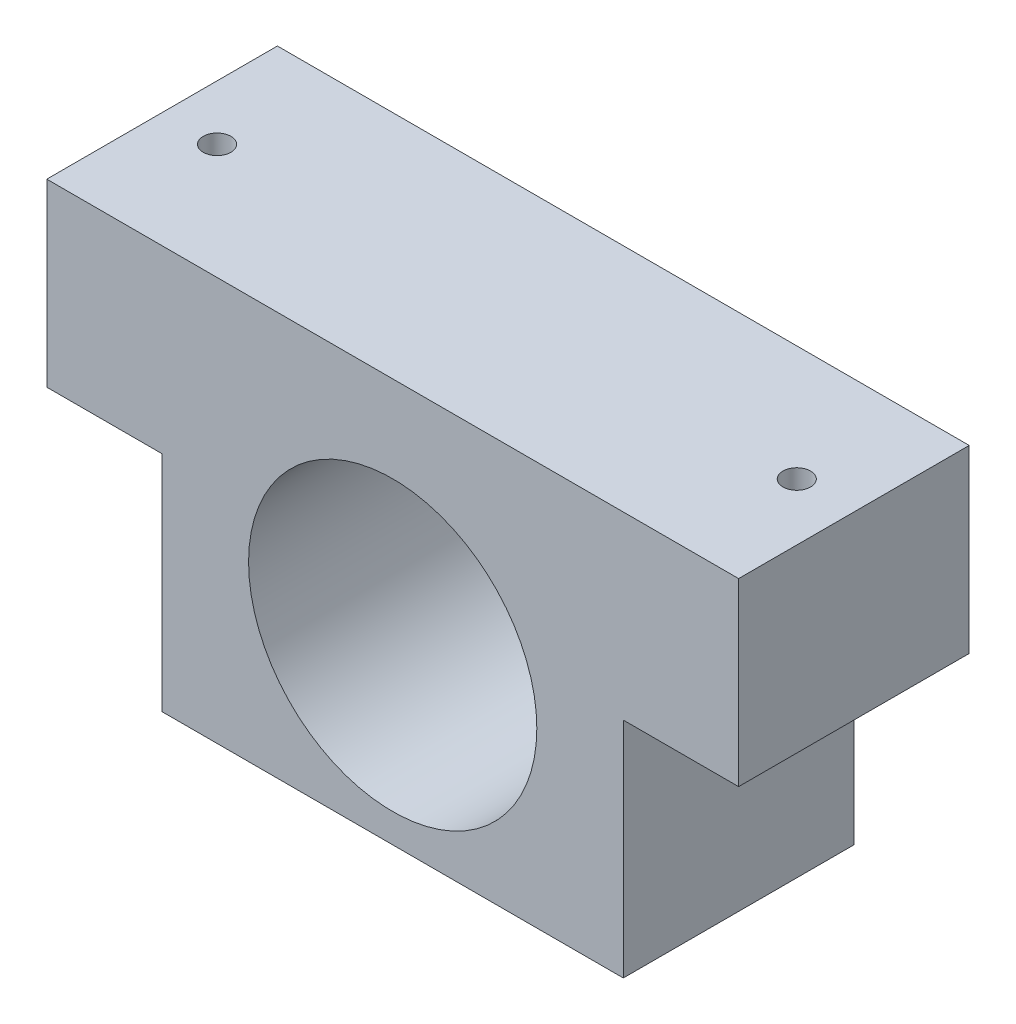
ISO-10303-21;
HEADER;
FILE_DESCRIPTION(('STEP AP214'),'2;1');
FILE_NAME('part.step','',(''),(''),'','','');
FILE_SCHEMA(('AUTOMOTIVE_DESIGN { 1 0 10303 214 1 1 1 1 }'));
ENDSEC;
DATA;
#1=APPLICATION_CONTEXT('core data for automotive mechanical design processes');
#2=APPLICATION_PROTOCOL_DEFINITION('international standard','automotive_design',2000,#1);
#3=PRODUCT_CONTEXT('',#1,'mechanical');
#4=PRODUCT('Part','Part','',(#3));
#5=PRODUCT_RELATED_PRODUCT_CATEGORY('part','',(#4));
#6=PRODUCT_DEFINITION_FORMATION('','',#4);
#7=PRODUCT_DEFINITION_CONTEXT('part definition',#1,'design');
#8=PRODUCT_DEFINITION('design','',#6,#7);
#9=PRODUCT_DEFINITION_SHAPE('','',#8);
#10=(LENGTH_UNIT() NAMED_UNIT(*) SI_UNIT(.MILLI.,.METRE.));
#11=(NAMED_UNIT(*) PLANE_ANGLE_UNIT() SI_UNIT($,.RADIAN.));
#12=(NAMED_UNIT(*) SI_UNIT($,.STERADIAN.) SOLID_ANGLE_UNIT());
#13=UNCERTAINTY_MEASURE_WITH_UNIT(LENGTH_MEASURE(1.E-05),#10,'distance_accuracy_value','');
#14=(GEOMETRIC_REPRESENTATION_CONTEXT(3) GLOBAL_UNCERTAINTY_ASSIGNED_CONTEXT((#13)) GLOBAL_UNIT_ASSIGNED_CONTEXT((#10,
#11,#12)) REPRESENTATION_CONTEXT('',''));
#15=CARTESIAN_POINT('',(0.,0.,0.));
#16=DIRECTION('',(0.,0.,1.));
#17=DIRECTION('',(1.,0.,0.));
#18=AXIS2_PLACEMENT_3D('',#15,#16,#17);
#19=CARTESIAN_POINT('',(0.,-145.626712597805,20.));
#20=DIRECTION('',(0.,1.,0.));
#21=DIRECTION('',(0.,0.,1.));
#22=AXIS2_PLACEMENT_3D('',#19,#20,#21);
#23=PLANE('',#22);
#24=CARTESIAN_POINT('',(-335.89732101394,-145.626712597805,10.));
#25=DIRECTION('',(0.,-1.,0.));
#26=DIRECTION('',(0.,0.,-1.));
#27=AXIS2_PLACEMENT_3D('',#24,#25,#26);
#28=CIRCLE('',#27,3.);
#29=CARTESIAN_POINT('',(-335.89732101394,-145.626712597805,7.));
#30=VERTEX_POINT('',#29);
#31=EDGE_CURVE('E210',#30,#30,#28,.T.);
#32=ORIENTED_EDGE('',*,*,#31,.F.);
#33=EDGE_LOOP('',(#32));
#34=FACE_BOUND('',#33,.T.);
#35=DIRECTION('',(1.,0.,0.));
#36=VECTOR('',#35,1.);
#37=CARTESIAN_POINT('',(0.,-145.626712597805,0.));
#38=LINE('',#37,#36);
#39=CARTESIAN_POINT('',(-340.665411140263,-145.626712597805,0.));
#40=VERTEX_POINT('',#39);
#41=CARTESIAN_POINT('',(-330.665411140263,-145.626712597805,0.));
#42=VERTEX_POINT('',#41);
#43=EDGE_CURVE('E138',#40,#42,#38,.T.);
#44=ORIENTED_EDGE('',*,*,#43,.T.);
#45=DIRECTION('',(0.,0.,-1.));
#46=VECTOR('',#45,1.);
#47=CARTESIAN_POINT('',(-330.665411140263,-145.626712597805,20.));
#48=LINE('',#47,#46);
#49=CARTESIAN_POINT('',(-330.665411140263,-145.626712597805,20.));
#50=VERTEX_POINT('',#49);
#51=EDGE_CURVE('E11',#50,#42,#48,.T.);
#52=ORIENTED_EDGE('',*,*,#51,.F.);
#53=DIRECTION('',(1.,0.,0.));
#54=VECTOR('',#53,1.);
#55=CARTESIAN_POINT('',(0.,-145.626712597805,20.));
#56=LINE('',#55,#54);
#57=CARTESIAN_POINT('',(-340.665411140263,-145.626712597805,20.));
#58=VERTEX_POINT('',#57);
#59=EDGE_CURVE('E184',#58,#50,#56,.T.);
#60=ORIENTED_EDGE('',*,*,#59,.F.);
#61=DIRECTION('',(0.,0.,-1.));
#62=VECTOR('',#61,1.);
#63=CARTESIAN_POINT('',(-340.665411140263,-145.626712597805,20.));
#64=LINE('',#63,#62);
#65=EDGE_CURVE('E131',#58,#40,#64,.T.);
#66=ORIENTED_EDGE('',*,*,#65,.T.);
#67=EDGE_LOOP('',(#44,#52,#60,#66));
#68=FACE_BOUND('',#67,.T.);
#69=ADVANCED_FACE('F39',(#34,#68),#23,.F.);
#70=CARTESIAN_POINT('',(-330.665411140263,0.,20.));
#71=DIRECTION('',(1.,0.,0.));
#72=DIRECTION('',(0.,0.,-1.));
#73=AXIS2_PLACEMENT_3D('',#70,#71,#72);
#74=PLANE('',#73);
#75=DIRECTION('',(0.,-1.,0.));
#76=VECTOR('',#75,1.);
#77=CARTESIAN_POINT('',(-330.665411140263,0.,0.));
#78=LINE('',#77,#76);
#79=CARTESIAN_POINT('',(-330.665411140263,-165.,0.));
#80=VERTEX_POINT('',#79);
#81=EDGE_CURVE('E142',#42,#80,#78,.T.);
#82=ORIENTED_EDGE('',*,*,#81,.T.);
#83=DIRECTION('',(0.,0.,-1.));
#84=VECTOR('',#83,1.);
#85=CARTESIAN_POINT('',(-330.665411140263,-165.,20.));
#86=LINE('',#85,#84);
#87=CARTESIAN_POINT('',(-330.665411140263,-165.,20.));
#88=VERTEX_POINT('',#87);
#89=EDGE_CURVE('E48',#88,#80,#86,.T.);
#90=ORIENTED_EDGE('',*,*,#89,.F.);
#91=DIRECTION('',(0.,-1.,0.));
#92=VECTOR('',#91,1.);
#93=CARTESIAN_POINT('',(-330.665411140263,0.,20.));
#94=LINE('',#93,#92);
#95=EDGE_CURVE('E95',#50,#88,#94,.T.);
#96=ORIENTED_EDGE('',*,*,#95,.F.);
#97=ORIENTED_EDGE('',*,*,#51,.T.);
#98=EDGE_LOOP('',(#82,#90,#96,#97));
#99=FACE_BOUND('',#98,.T.);
#100=ADVANCED_FACE('F171',(#99),#74,.F.);
#101=CARTESIAN_POINT('',(0.,-165.,20.));
#102=DIRECTION('',(0.,-1.,0.));
#103=DIRECTION('',(0.,0.,-1.));
#104=AXIS2_PLACEMENT_3D('',#101,#102,#103);
#105=PLANE('',#104);
#106=DIRECTION('',(-1.,0.,0.));
#107=VECTOR('',#106,1.);
#108=CARTESIAN_POINT('',(0.,-165.,0.));
#109=LINE('',#108,#107);
#110=CARTESIAN_POINT('',(-290.665411140263,-165.,0.));
#111=VERTEX_POINT('',#110);
#112=EDGE_CURVE('E145',#111,#80,#109,.T.);
#113=ORIENTED_EDGE('',*,*,#112,.F.);
#114=DIRECTION('',(0.,0.,-1.));
#115=VECTOR('',#114,1.);
#116=CARTESIAN_POINT('',(-290.665411140263,-165.,20.));
#117=LINE('',#116,#115);
#118=CARTESIAN_POINT('',(-290.665411140263,-165.,20.));
#119=VERTEX_POINT('',#118);
#120=EDGE_CURVE('E164',#119,#111,#117,.T.);
#121=ORIENTED_EDGE('',*,*,#120,.F.);
#122=DIRECTION('',(-1.,0.,0.));
#123=VECTOR('',#122,1.);
#124=CARTESIAN_POINT('',(0.,-165.,20.));
#125=LINE('',#124,#123);
#126=EDGE_CURVE('E170',#119,#88,#125,.T.);
#127=ORIENTED_EDGE('',*,*,#126,.T.);
#128=ORIENTED_EDGE('',*,*,#89,.T.);
#129=EDGE_LOOP('',(#113,#121,#127,#128));
#130=FACE_BOUND('',#129,.T.);
#131=ADVANCED_FACE('F168',(#130),#105,.T.);
#132=CARTESIAN_POINT('',(-290.665411140263,0.,20.));
#133=DIRECTION('',(1.,0.,0.));
#134=DIRECTION('',(0.,0.,-1.));
#135=AXIS2_PLACEMENT_3D('',#132,#133,#134);
#136=PLANE('',#135);
#137=DIRECTION('',(0.,-1.,0.));
#138=VECTOR('',#137,1.);
#139=CARTESIAN_POINT('',(-290.665411140263,0.,0.));
#140=LINE('',#139,#138);
#141=CARTESIAN_POINT('',(-290.665411140263,-145.626712597805,0.));
#142=VERTEX_POINT('',#141);
#143=EDGE_CURVE('E148',#142,#111,#140,.T.);
#144=ORIENTED_EDGE('',*,*,#143,.F.);
#145=DIRECTION('',(0.,0.,-1.));
#146=VECTOR('',#145,1.);
#147=CARTESIAN_POINT('',(-290.665411140263,-145.626712597805,20.));
#148=LINE('',#147,#146);
#149=CARTESIAN_POINT('',(-290.665411140263,-145.626712597805,20.));
#150=VERTEX_POINT('',#149);
#151=EDGE_CURVE('E162',#150,#142,#148,.T.);
#152=ORIENTED_EDGE('',*,*,#151,.F.);
#153=DIRECTION('',(0.,-1.,0.));
#154=VECTOR('',#153,1.);
#155=CARTESIAN_POINT('',(-290.665411140263,0.,20.));
#156=LINE('',#155,#154);
#157=EDGE_CURVE('E181',#150,#119,#156,.T.);
#158=ORIENTED_EDGE('',*,*,#157,.T.);
#159=ORIENTED_EDGE('',*,*,#120,.T.);
#160=EDGE_LOOP('',(#144,#152,#158,#159));
#161=FACE_BOUND('',#160,.T.);
#162=ADVANCED_FACE('F179',(#161),#136,.T.);
#163=CARTESIAN_POINT('',(0.,-145.626712597805,20.));
#164=DIRECTION('',(0.,1.,0.));
#165=DIRECTION('',(0.,0.,1.));
#166=AXIS2_PLACEMENT_3D('',#163,#164,#165);
#167=PLANE('',#166);
#168=CARTESIAN_POINT('',(-285.620390856453,-145.626712597805,10.));
#169=DIRECTION('',(0.,-1.,0.));
#170=DIRECTION('',(0.,0.,-1.));
#171=AXIS2_PLACEMENT_3D('',#168,#169,#170);
#172=CIRCLE('',#171,3.);
#173=CARTESIAN_POINT('',(-285.620390856453,-145.626712597805,7.));
#174=VERTEX_POINT('',#173);
#175=EDGE_CURVE('E198',#174,#174,#172,.T.);
#176=ORIENTED_EDGE('',*,*,#175,.F.);
#177=EDGE_LOOP('',(#176));
#178=FACE_BOUND('',#177,.T.);
#179=DIRECTION('',(1.,0.,0.));
#180=VECTOR('',#179,1.);
#181=CARTESIAN_POINT('',(0.,-145.626712597805,0.));
#182=LINE('',#181,#180);
#183=CARTESIAN_POINT('',(-280.665411140263,-145.626712597805,0.));
#184=VERTEX_POINT('',#183);
#185=EDGE_CURVE('E151',#142,#184,#182,.T.);
#186=ORIENTED_EDGE('',*,*,#185,.T.);
#187=DIRECTION('',(0.,0.,-1.));
#188=VECTOR('',#187,1.);
#189=CARTESIAN_POINT('',(-280.665411140263,-145.626712597805,20.));
#190=LINE('',#189,#188);
#191=CARTESIAN_POINT('',(-280.665411140263,-145.626712597805,20.));
#192=VERTEX_POINT('',#191);
#193=EDGE_CURVE('E120',#192,#184,#190,.T.);
#194=ORIENTED_EDGE('',*,*,#193,.F.);
#195=DIRECTION('',(1.,0.,0.));
#196=VECTOR('',#195,1.);
#197=CARTESIAN_POINT('',(0.,-145.626712597805,20.));
#198=LINE('',#197,#196);
#199=EDGE_CURVE('E126',#150,#192,#198,.T.);
#200=ORIENTED_EDGE('',*,*,#199,.F.);
#201=ORIENTED_EDGE('',*,*,#151,.T.);
#202=EDGE_LOOP('',(#186,#194,#200,#201));
#203=FACE_BOUND('',#202,.T.);
#204=ADVANCED_FACE('F236',(#178,#203),#167,.F.);
#205=CARTESIAN_POINT('',(-280.665411140263,0.,20.));
#206=DIRECTION('',(1.,0.,0.));
#207=DIRECTION('',(0.,0.,-1.));
#208=AXIS2_PLACEMENT_3D('',#205,#206,#207);
#209=PLANE('',#208);
#210=DIRECTION('',(0.,-1.,0.));
#211=VECTOR('',#210,1.);
#212=CARTESIAN_POINT('',(-280.665411140263,0.,0.));
#213=LINE('',#212,#211);
#214=CARTESIAN_POINT('',(-280.665411140263,-130.,0.));
#215=VERTEX_POINT('',#214);
#216=EDGE_CURVE('E115',#215,#184,#213,.T.);
#217=ORIENTED_EDGE('',*,*,#216,.F.);
#218=DIRECTION('',(0.,0.,-1.));
#219=VECTOR('',#218,1.);
#220=CARTESIAN_POINT('',(-280.665411140263,-130.,20.));
#221=LINE('',#220,#219);
#222=CARTESIAN_POINT('',(-280.665411140263,-130.,20.));
#223=VERTEX_POINT('',#222);
#224=EDGE_CURVE('E110',#223,#215,#221,.T.);
#225=ORIENTED_EDGE('',*,*,#224,.F.);
#226=DIRECTION('',(0.,-1.,0.));
#227=VECTOR('',#226,1.);
#228=CARTESIAN_POINT('',(-280.665411140263,0.,20.));
#229=LINE('',#228,#227);
#230=EDGE_CURVE('E113',#223,#192,#229,.T.);
#231=ORIENTED_EDGE('',*,*,#230,.T.);
#232=ORIENTED_EDGE('',*,*,#193,.T.);
#233=EDGE_LOOP('',(#217,#225,#231,#232));
#234=FACE_BOUND('',#233,.T.);
#235=ADVANCED_FACE('F112',(#234),#209,.T.);
#236=CARTESIAN_POINT('',(0.,-130.,20.));
#237=DIRECTION('',(0.,1.,0.));
#238=DIRECTION('',(0.,0.,1.));
#239=AXIS2_PLACEMENT_3D('',#236,#237,#238);
#240=PLANE('',#239);
#241=CARTESIAN_POINT('',(-335.89732101394,-130.,10.));
#242=DIRECTION('',(0.,-1.,0.));
#243=DIRECTION('',(0.,0.,-1.));
#244=AXIS2_PLACEMENT_3D('',#241,#242,#243);
#245=CIRCLE('',#244,1.19999999999998);
#246=CARTESIAN_POINT('',(-335.89732101394,-130.,8.80000000000002));
#247=VERTEX_POINT('',#246);
#248=EDGE_CURVE('E201',#247,#247,#245,.T.);
#249=ORIENTED_EDGE('',*,*,#248,.T.);
#250=EDGE_LOOP('',(#249));
#251=FACE_BOUND('',#250,.T.);
#252=CARTESIAN_POINT('',(-285.620390856453,-130.,10.));
#253=DIRECTION('',(0.,-1.,0.));
#254=DIRECTION('',(0.,0.,-1.));
#255=AXIS2_PLACEMENT_3D('',#252,#253,#254);
#256=CIRCLE('',#255,1.19999999999998);
#257=CARTESIAN_POINT('',(-285.620390856453,-130.,8.80000000000002));
#258=VERTEX_POINT('',#257);
#259=EDGE_CURVE('E139',#258,#258,#256,.T.);
#260=ORIENTED_EDGE('',*,*,#259,.T.);
#261=EDGE_LOOP('',(#260));
#262=FACE_BOUND('',#261,.T.);
#263=DIRECTION('',(1.,0.,0.));
#264=VECTOR('',#263,1.);
#265=CARTESIAN_POINT('',(0.,-130.,0.));
#266=LINE('',#265,#264);
#267=CARTESIAN_POINT('',(-340.665411140263,-130.,0.));
#268=VERTEX_POINT('',#267);
#269=EDGE_CURVE('E155',#268,#215,#266,.T.);
#270=ORIENTED_EDGE('',*,*,#269,.F.);
#271=DIRECTION('',(0.,0.,-1.));
#272=VECTOR('',#271,1.);
#273=CARTESIAN_POINT('',(-340.665411140263,-130.,20.));
#274=LINE('',#273,#272);
#275=CARTESIAN_POINT('',(-340.665411140263,-130.,20.));
#276=VERTEX_POINT('',#275);
#277=EDGE_CURVE('E84',#276,#268,#274,.T.);
#278=ORIENTED_EDGE('',*,*,#277,.F.);
#279=DIRECTION('',(1.,0.,0.));
#280=VECTOR('',#279,1.);
#281=CARTESIAN_POINT('',(0.,-130.,20.));
#282=LINE('',#281,#280);
#283=EDGE_CURVE('E123',#276,#223,#282,.T.);
#284=ORIENTED_EDGE('',*,*,#283,.T.);
#285=ORIENTED_EDGE('',*,*,#224,.T.);
#286=EDGE_LOOP('',(#270,#278,#284,#285));
#287=FACE_BOUND('',#286,.T.);
#288=ADVANCED_FACE('F129',(#251,#262,#287),#240,.T.);
#289=CARTESIAN_POINT('',(-310.665411140263,-150.,20.));
#290=DIRECTION('',(0.,0.,-1.));
#291=DIRECTION('',(-1.,0.,0.));
#292=AXIS2_PLACEMENT_3D('',#289,#290,#291);
#293=CYLINDRICAL_SURFACE('',#292,12.5);
#294=CARTESIAN_POINT('',(-310.665411140263,-150.,20.));
#295=DIRECTION('',(0.,0.,1.));
#296=DIRECTION('',(1.,0.,0.));
#297=AXIS2_PLACEMENT_3D('',#294,#295,#296);
#298=CIRCLE('',#297,12.5);
#299=CARTESIAN_POINT('',(-298.165411140263,-150.,20.));
#300=VERTEX_POINT('',#299);
#301=EDGE_CURVE('E158',#300,#300,#298,.T.);
#302=ORIENTED_EDGE('',*,*,#301,.T.);
#303=EDGE_LOOP('',(#302));
#304=FACE_BOUND('',#303,.T.);
#305=CARTESIAN_POINT('',(-310.665411140263,-150.,0.));
#306=DIRECTION('',(0.,0.,1.));
#307=DIRECTION('',(1.,0.,0.));
#308=AXIS2_PLACEMENT_3D('',#305,#306,#307);
#309=CIRCLE('',#308,12.5);
#310=CARTESIAN_POINT('',(-298.165411140263,-150.,0.));
#311=VERTEX_POINT('',#310);
#312=EDGE_CURVE('E135',#311,#311,#309,.T.);
#313=ORIENTED_EDGE('',*,*,#312,.F.);
#314=EDGE_LOOP('',(#313));
#315=FACE_BOUND('',#314,.T.);
#316=ADVANCED_FACE('F41',(#304,#315),#293,.F.);
#317=CARTESIAN_POINT('',(-340.665411140263,0.,20.));
#318=DIRECTION('',(1.,0.,0.));
#319=DIRECTION('',(0.,0.,-1.));
#320=AXIS2_PLACEMENT_3D('',#317,#318,#319);
#321=PLANE('',#320);
#322=DIRECTION('',(0.,-1.,0.));
#323=VECTOR('',#322,1.);
#324=CARTESIAN_POINT('',(-340.665411140263,0.,0.));
#325=LINE('',#324,#323);
#326=EDGE_CURVE('E87',#268,#40,#325,.T.);
#327=ORIENTED_EDGE('',*,*,#326,.T.);
#328=ORIENTED_EDGE('',*,*,#65,.F.);
#329=DIRECTION('',(0.,-1.,0.));
#330=VECTOR('',#329,1.);
#331=CARTESIAN_POINT('',(-340.665411140263,0.,20.));
#332=LINE('',#331,#330);
#333=EDGE_CURVE('E56',#276,#58,#332,.T.);
#334=ORIENTED_EDGE('',*,*,#333,.F.);
#335=ORIENTED_EDGE('',*,*,#277,.T.);
#336=EDGE_LOOP('',(#327,#328,#334,#335));
#337=FACE_BOUND('',#336,.T.);
#338=ADVANCED_FACE('F219',(#337),#321,.F.);
#339=CARTESIAN_POINT('',(0.,0.,20.));
#340=DIRECTION('',(0.,0.,1.));
#341=DIRECTION('',(1.,0.,0.));
#342=AXIS2_PLACEMENT_3D('',#339,#340,#341);
#343=PLANE('',#342);
#344=ORIENTED_EDGE('',*,*,#301,.F.);
#345=EDGE_LOOP('',(#344));
#346=FACE_BOUND('',#345,.T.);
#347=ORIENTED_EDGE('',*,*,#59,.T.);
#348=ORIENTED_EDGE('',*,*,#95,.T.);
#349=ORIENTED_EDGE('',*,*,#126,.F.);
#350=ORIENTED_EDGE('',*,*,#157,.F.);
#351=ORIENTED_EDGE('',*,*,#199,.T.);
#352=ORIENTED_EDGE('',*,*,#230,.F.);
#353=ORIENTED_EDGE('',*,*,#283,.F.);
#354=ORIENTED_EDGE('',*,*,#333,.T.);
#355=EDGE_LOOP('',(#347,#348,#349,#350,#351,#352,#353,#354));
#356=FACE_BOUND('',#355,.T.);
#357=ADVANCED_FACE('F122',(#346,#356),#343,.T.);
#358=CARTESIAN_POINT('',(0.,0.,0.));
#359=DIRECTION('',(0.,0.,1.));
#360=DIRECTION('',(1.,0.,0.));
#361=AXIS2_PLACEMENT_3D('',#358,#359,#360);
#362=PLANE('',#361);
#363=ORIENTED_EDGE('',*,*,#312,.T.);
#364=EDGE_LOOP('',(#363));
#365=FACE_BOUND('',#364,.T.);
#366=ORIENTED_EDGE('',*,*,#43,.F.);
#367=ORIENTED_EDGE('',*,*,#326,.F.);
#368=ORIENTED_EDGE('',*,*,#269,.T.);
#369=ORIENTED_EDGE('',*,*,#216,.T.);
#370=ORIENTED_EDGE('',*,*,#185,.F.);
#371=ORIENTED_EDGE('',*,*,#143,.T.);
#372=ORIENTED_EDGE('',*,*,#112,.T.);
#373=ORIENTED_EDGE('',*,*,#81,.F.);
#374=EDGE_LOOP('',(#366,#367,#368,#369,#370,#371,#372,#373));
#375=FACE_BOUND('',#374,.T.);
#376=ADVANCED_FACE('F175',(#365,#375),#362,.F.);
#377=CARTESIAN_POINT('',(-285.620390856453,-145.626712597805,10.));
#378=DIRECTION('',(0.,-1.,0.));
#379=DIRECTION('',(0.,0.,-1.));
#380=AXIS2_PLACEMENT_3D('',#377,#378,#379);
#381=CYLINDRICAL_SURFACE('',#380,1.19999999999998);
#382=ORIENTED_EDGE('',*,*,#259,.F.);
#383=EDGE_LOOP('',(#382));
#384=FACE_BOUND('',#383,.T.);
#385=CARTESIAN_POINT('',(-285.620390856453,-145.126712597805,10.));
#386=DIRECTION('',(0.,-1.,0.));
#387=DIRECTION('',(0.,0.,-1.));
#388=AXIS2_PLACEMENT_3D('',#385,#386,#387);
#389=CIRCLE('',#388,1.19999999999998);
#390=CARTESIAN_POINT('',(-285.620390856453,-145.126712597805,8.80000000000002));
#391=VERTEX_POINT('',#390);
#392=EDGE_CURVE('E192',#391,#391,#389,.T.);
#393=ORIENTED_EDGE('',*,*,#392,.T.);
#394=EDGE_LOOP('',(#393));
#395=FACE_BOUND('',#394,.T.);
#396=ADVANCED_FACE('F292',(#384,#395),#381,.F.);
#397=CARTESIAN_POINT('',(-284.420390856453,-145.126712597805,10.));
#398=DIRECTION('',(0.,1.,0.));
#399=DIRECTION('',(0.,0.,1.));
#400=AXIS2_PLACEMENT_3D('',#397,#398,#399);
#401=PLANE('',#400);
#402=ORIENTED_EDGE('',*,*,#392,.F.);
#403=EDGE_LOOP('',(#402));
#404=FACE_BOUND('',#403,.T.);
#405=CARTESIAN_POINT('',(-285.620390856453,-145.126712597805,10.));
#406=DIRECTION('',(0.,-1.,0.));
#407=DIRECTION('',(0.,0.,-1.));
#408=AXIS2_PLACEMENT_3D('',#405,#406,#407);
#409=CIRCLE('',#408,3.);
#410=CARTESIAN_POINT('',(-285.620390856453,-145.126712597805,7.));
#411=VERTEX_POINT('',#410);
#412=EDGE_CURVE('E195',#411,#411,#409,.T.);
#413=ORIENTED_EDGE('',*,*,#412,.T.);
#414=EDGE_LOOP('',(#413));
#415=FACE_BOUND('',#414,.T.);
#416=ADVANCED_FACE('F320',(#404,#415),#401,.F.);
#417=CARTESIAN_POINT('',(-285.620390856453,-145.626712597805,10.));
#418=DIRECTION('',(0.,-1.,0.));
#419=DIRECTION('',(0.,0.,-1.));
#420=AXIS2_PLACEMENT_3D('',#417,#418,#419);
#421=CYLINDRICAL_SURFACE('',#420,3.);
#422=ORIENTED_EDGE('',*,*,#412,.F.);
#423=EDGE_LOOP('',(#422));
#424=FACE_BOUND('',#423,.T.);
#425=ORIENTED_EDGE('',*,*,#175,.T.);
#426=EDGE_LOOP('',(#425));
#427=FACE_BOUND('',#426,.T.);
#428=ADVANCED_FACE('F327',(#424,#427),#421,.F.);
#429=CARTESIAN_POINT('',(-335.89732101394,-145.626712597805,10.));
#430=DIRECTION('',(0.,-1.,0.));
#431=DIRECTION('',(0.,0.,-1.));
#432=AXIS2_PLACEMENT_3D('',#429,#430,#431);
#433=CYLINDRICAL_SURFACE('',#432,1.19999999999998);
#434=ORIENTED_EDGE('',*,*,#248,.F.);
#435=EDGE_LOOP('',(#434));
#436=FACE_BOUND('',#435,.T.);
#437=CARTESIAN_POINT('',(-335.89732101394,-145.126712597805,10.));
#438=DIRECTION('',(0.,-1.,0.));
#439=DIRECTION('',(0.,0.,-1.));
#440=AXIS2_PLACEMENT_3D('',#437,#438,#439);
#441=CIRCLE('',#440,1.19999999999998);
#442=CARTESIAN_POINT('',(-335.89732101394,-145.126712597805,8.80000000000002));
#443=VERTEX_POINT('',#442);
#444=EDGE_CURVE('E204',#443,#443,#441,.T.);
#445=ORIENTED_EDGE('',*,*,#444,.T.);
#446=EDGE_LOOP('',(#445));
#447=FACE_BOUND('',#446,.T.);
#448=ADVANCED_FACE('F335',(#436,#447),#433,.F.);
#449=CARTESIAN_POINT('',(-334.69732101394,-145.126712597805,10.));
#450=DIRECTION('',(0.,1.,0.));
#451=DIRECTION('',(0.,0.,1.));
#452=AXIS2_PLACEMENT_3D('',#449,#450,#451);
#453=PLANE('',#452);
#454=ORIENTED_EDGE('',*,*,#444,.F.);
#455=EDGE_LOOP('',(#454));
#456=FACE_BOUND('',#455,.T.);
#457=CARTESIAN_POINT('',(-335.89732101394,-145.126712597805,10.));
#458=DIRECTION('',(0.,-1.,0.));
#459=DIRECTION('',(0.,0.,-1.));
#460=AXIS2_PLACEMENT_3D('',#457,#458,#459);
#461=CIRCLE('',#460,3.);
#462=CARTESIAN_POINT('',(-335.89732101394,-145.126712597805,7.));
#463=VERTEX_POINT('',#462);
#464=EDGE_CURVE('E207',#463,#463,#461,.T.);
#465=ORIENTED_EDGE('',*,*,#464,.T.);
#466=EDGE_LOOP('',(#465));
#467=FACE_BOUND('',#466,.T.);
#468=ADVANCED_FACE('F343',(#456,#467),#453,.F.);
#469=CARTESIAN_POINT('',(-335.89732101394,-145.626712597805,10.));
#470=DIRECTION('',(0.,-1.,0.));
#471=DIRECTION('',(0.,0.,-1.));
#472=AXIS2_PLACEMENT_3D('',#469,#470,#471);
#473=CYLINDRICAL_SURFACE('',#472,3.);
#474=ORIENTED_EDGE('',*,*,#464,.F.);
#475=EDGE_LOOP('',(#474));
#476=FACE_BOUND('',#475,.T.);
#477=ORIENTED_EDGE('',*,*,#31,.T.);
#478=EDGE_LOOP('',(#477));
#479=FACE_BOUND('',#478,.T.);
#480=ADVANCED_FACE('F214',(#476,#479),#473,.F.);
#481=CLOSED_SHELL('',(#69,#100,#131,#162,#204,#235,#288,#316,#338,#357,#376,#396,#416,#428,#448,
#468,#480));
#482=MANIFOLD_SOLID_BREP('B2',#481);
#483=ADVANCED_BREP_SHAPE_REPRESENTATION('',(#18,#482),#14);
#484=SHAPE_DEFINITION_REPRESENTATION(#9,#483);
ENDSEC;
END-ISO-10303-21;
